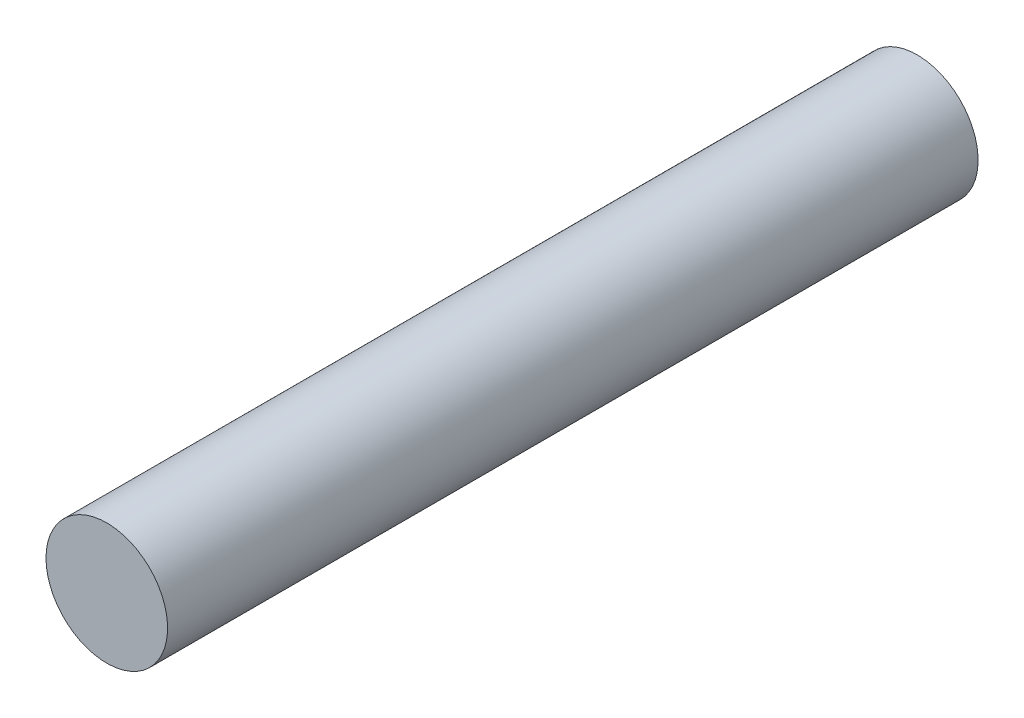
ISO-10303-21;
HEADER;
FILE_DESCRIPTION(('STEP AP214'),'2;1');
FILE_NAME('part.step','',(''),(''),'','','');
FILE_SCHEMA(('AUTOMOTIVE_DESIGN { 1 0 10303 214 1 1 1 1 }'));
ENDSEC;
DATA;
#1=APPLICATION_CONTEXT('core data for automotive mechanical design processes');
#2=APPLICATION_PROTOCOL_DEFINITION('international standard','automotive_design',2000,#1);
#3=PRODUCT_CONTEXT('',#1,'mechanical');
#4=PRODUCT('Part','Part','',(#3));
#5=PRODUCT_RELATED_PRODUCT_CATEGORY('part','',(#4));
#6=PRODUCT_DEFINITION_FORMATION('','',#4);
#7=PRODUCT_DEFINITION_CONTEXT('part definition',#1,'design');
#8=PRODUCT_DEFINITION('design','',#6,#7);
#9=PRODUCT_DEFINITION_SHAPE('','',#8);
#10=(LENGTH_UNIT() NAMED_UNIT(*) SI_UNIT(.MILLI.,.METRE.));
#11=(NAMED_UNIT(*) PLANE_ANGLE_UNIT() SI_UNIT($,.RADIAN.));
#12=(NAMED_UNIT(*) SI_UNIT($,.STERADIAN.) SOLID_ANGLE_UNIT());
#13=UNCERTAINTY_MEASURE_WITH_UNIT(LENGTH_MEASURE(1.E-05),#10,'distance_accuracy_value','');
#14=(GEOMETRIC_REPRESENTATION_CONTEXT(3) GLOBAL_UNCERTAINTY_ASSIGNED_CONTEXT((#13)) GLOBAL_UNIT_ASSIGNED_CONTEXT((#10,
#11,#12)) REPRESENTATION_CONTEXT('',''));
#15=CARTESIAN_POINT('',(0.,0.,0.));
#16=DIRECTION('',(0.,0.,1.));
#17=DIRECTION('',(1.,0.,0.));
#18=AXIS2_PLACEMENT_3D('',#15,#16,#17);
#19=CARTESIAN_POINT('',(0.,0.,60.));
#20=DIRECTION('',(0.,0.,-1.));
#21=DIRECTION('',(-1.,0.,0.));
#22=AXIS2_PLACEMENT_3D('',#19,#20,#21);
#23=CYLINDRICAL_SURFACE('',#22,4.5);
#24=CARTESIAN_POINT('',(0.,0.,60.));
#25=DIRECTION('',(0.,0.,1.));
#26=DIRECTION('',(1.,0.,0.));
#27=AXIS2_PLACEMENT_3D('',#24,#25,#26);
#28=CIRCLE('',#27,4.5);
#29=CARTESIAN_POINT('',(-4.5,0.,60.));
#30=VERTEX_POINT('',#29);
#31=EDGE_CURVE('E10',#30,#30,#28,.T.);
#32=CARTESIAN_POINT('',(0.,0.,0.));
#33=DIRECTION('',(0.,0.,1.));
#34=DIRECTION('',(1.,0.,0.));
#35=AXIS2_PLACEMENT_3D('',#32,#33,#34);
#36=CIRCLE('',#35,4.5);
#37=CARTESIAN_POINT('',(-4.5,0.,0.));
#38=VERTEX_POINT('',#37);
#39=EDGE_CURVE('E34',#38,#38,#36,.T.);
#40=CARTESIAN_POINT('',(-4.5,0.,60.));
#41=CARTESIAN_POINT('',(-4.5,0.,59.375));
#42=CARTESIAN_POINT('',(-4.5,0.,58.75));
#43=CARTESIAN_POINT('',(-4.5,0.,57.5));
#44=CARTESIAN_POINT('',(-4.5,0.,56.875));
#45=CARTESIAN_POINT('',(-4.5,0.,55.625));
#46=CARTESIAN_POINT('',(-4.5,0.,55.));
#47=CARTESIAN_POINT('',(-4.5,0.,53.75));
#48=CARTESIAN_POINT('',(-4.5,0.,53.125));
#49=CARTESIAN_POINT('',(-4.5,0.,51.875));
#50=CARTESIAN_POINT('',(-4.5,0.,51.25));
#51=CARTESIAN_POINT('',(-4.5,0.,50.));
#52=CARTESIAN_POINT('',(-4.5,0.,49.375));
#53=CARTESIAN_POINT('',(-4.5,0.,48.125));
#54=CARTESIAN_POINT('',(-4.5,0.,47.5));
#55=CARTESIAN_POINT('',(-4.5,0.,46.25));
#56=CARTESIAN_POINT('',(-4.5,0.,45.625));
#57=CARTESIAN_POINT('',(-4.5,0.,44.375));
#58=CARTESIAN_POINT('',(-4.5,0.,43.75));
#59=CARTESIAN_POINT('',(-4.5,0.,42.5));
#60=CARTESIAN_POINT('',(-4.5,0.,41.875));
#61=CARTESIAN_POINT('',(-4.5,0.,40.625));
#62=CARTESIAN_POINT('',(-4.5,0.,40.));
#63=CARTESIAN_POINT('',(-4.5,0.,38.75));
#64=CARTESIAN_POINT('',(-4.5,0.,38.125));
#65=CARTESIAN_POINT('',(-4.5,0.,36.875));
#66=CARTESIAN_POINT('',(-4.5,0.,36.25));
#67=CARTESIAN_POINT('',(-4.5,0.,35.));
#68=CARTESIAN_POINT('',(-4.5,0.,34.375));
#69=CARTESIAN_POINT('',(-4.5,0.,33.125));
#70=CARTESIAN_POINT('',(-4.5,0.,32.5));
#71=CARTESIAN_POINT('',(-4.5,0.,31.25));
#72=CARTESIAN_POINT('',(-4.5,0.,30.625));
#73=CARTESIAN_POINT('',(-4.5,0.,29.375));
#74=CARTESIAN_POINT('',(-4.5,0.,28.75));
#75=CARTESIAN_POINT('',(-4.5,0.,27.5));
#76=CARTESIAN_POINT('',(-4.5,0.,26.875));
#77=CARTESIAN_POINT('',(-4.5,0.,25.625));
#78=CARTESIAN_POINT('',(-4.5,0.,25.));
#79=CARTESIAN_POINT('',(-4.5,0.,23.75));
#80=CARTESIAN_POINT('',(-4.5,0.,23.125));
#81=CARTESIAN_POINT('',(-4.5,0.,21.875));
#82=CARTESIAN_POINT('',(-4.5,0.,21.25));
#83=CARTESIAN_POINT('',(-4.5,0.,20.));
#84=CARTESIAN_POINT('',(-4.5,0.,19.375));
#85=CARTESIAN_POINT('',(-4.5,0.,18.125));
#86=CARTESIAN_POINT('',(-4.5,0.,17.5));
#87=CARTESIAN_POINT('',(-4.5,0.,16.25));
#88=CARTESIAN_POINT('',(-4.5,0.,15.625));
#89=CARTESIAN_POINT('',(-4.5,0.,14.375));
#90=CARTESIAN_POINT('',(-4.5,0.,13.75));
#91=CARTESIAN_POINT('',(-4.5,0.,12.5));
#92=CARTESIAN_POINT('',(-4.5,0.,11.875));
#93=CARTESIAN_POINT('',(-4.5,0.,10.625));
#94=CARTESIAN_POINT('',(-4.5,0.,10.));
#95=CARTESIAN_POINT('',(-4.5,0.,8.75));
#96=CARTESIAN_POINT('',(-4.5,0.,8.125));
#97=CARTESIAN_POINT('',(-4.5,0.,6.875));
#98=CARTESIAN_POINT('',(-4.5,0.,6.25));
#99=CARTESIAN_POINT('',(-4.5,0.,5.));
#100=CARTESIAN_POINT('',(-4.5,0.,4.375));
#101=CARTESIAN_POINT('',(-4.5,0.,3.125));
#102=CARTESIAN_POINT('',(-4.5,0.,2.5));
#103=CARTESIAN_POINT('',(-4.5,0.,1.25));
#104=CARTESIAN_POINT('',(-4.5,0.,0.625000000000001));
#105=CARTESIAN_POINT('',(-4.5,0.,0.));
#106=B_SPLINE_CURVE_WITH_KNOTS('',3,(#40,#41,#42,#43,#44,#45,#46,#47,#48,#49,#50,#51,#52,#53,
#54,#55,#56,#57,#58,#59,#60,#61,#62,#63,#64,#65,#66,#67,#68,#69,#70,#71,#72,#73,#74,#75,#76,#77,
#78,#79,#80,#81,#82,#83,#84,#85,#86,#87,#88,#89,#90,#91,#92,#93,#94,#95,#96,#97,#98,#99,#100,
#101,#102,#103,#104,#105),.UNSPECIFIED.,.F.,.F.,(4,2,2,2,2,2,2,2,2,2,2,2,2,2,2,2,2,2,2,2,2,2,2,
2,2,2,2,2,2,2,2,2,4),(0.,1.875,3.75,5.62500000000001,7.50000000000001,9.375,11.25,13.125,15.,
16.875,18.75,20.625,22.5,24.375,26.25,28.125,30.,31.875,33.75,35.625,37.5,39.375,41.25,43.125,
45.,46.875,48.75,50.625,52.5,54.375,56.25,58.125,60.),.UNSPECIFIED.);
#107=EDGE_CURVE('BSEAM31',#30,#38,#106,.T.);
#108=ORIENTED_EDGE('',*,*,#31,.F.);
#109=ORIENTED_EDGE('',*,*,#39,.T.);
#110=ORIENTED_EDGE('',*,*,#107,.T.);
#111=ORIENTED_EDGE('',*,*,#107,.F.);
#112=EDGE_LOOP('',(#108,#110,#109,#111));
#113=FACE_BOUND('',#112,.T.);
#114=ADVANCED_FACE('F31',(#113),#23,.T.);
#115=CARTESIAN_POINT('',(0.,0.,60.));
#116=DIRECTION('',(0.,0.,1.));
#117=DIRECTION('',(1.,0.,0.));
#118=AXIS2_PLACEMENT_3D('',#115,#116,#117);
#119=PLANE('',#118);
#120=ORIENTED_EDGE('',*,*,#31,.T.);
#121=EDGE_LOOP('',(#120));
#122=FACE_BOUND('',#121,.T.);
#123=ADVANCED_FACE('F46',(#122),#119,.T.);
#124=CARTESIAN_POINT('',(0.,0.,0.));
#125=DIRECTION('',(0.,0.,1.));
#126=DIRECTION('',(1.,0.,0.));
#127=AXIS2_PLACEMENT_3D('',#124,#125,#126);
#128=PLANE('',#127);
#129=ORIENTED_EDGE('',*,*,#39,.F.);
#130=EDGE_LOOP('',(#129));
#131=FACE_BOUND('',#130,.T.);
#132=ADVANCED_FACE('F44',(#131),#128,.F.);
#133=CLOSED_SHELL('',(#114,#123,#132));
#134=MANIFOLD_SOLID_BREP('B2',#133);
#135=ADVANCED_BREP_SHAPE_REPRESENTATION('',(#18,#134),#14);
#136=SHAPE_DEFINITION_REPRESENTATION(#9,#135);
ENDSEC;
END-ISO-10303-21;
